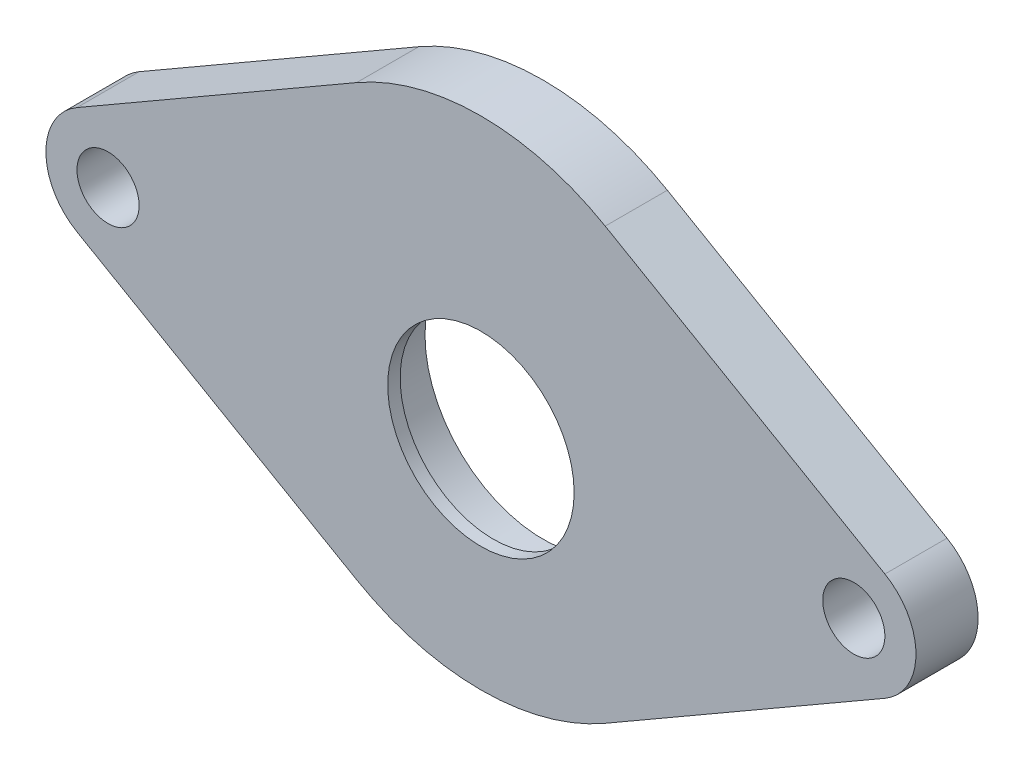
ISO-10303-21;
HEADER;
FILE_DESCRIPTION(('STEP AP214'),'2;1');
FILE_NAME('part.step','',(''),(''),'','','');
FILE_SCHEMA(('AUTOMOTIVE_DESIGN { 1 0 10303 214 1 1 1 1 }'));
ENDSEC;
DATA;
#1=APPLICATION_CONTEXT('core data for automotive mechanical design processes');
#2=APPLICATION_PROTOCOL_DEFINITION('international standard','automotive_design',2000,#1);
#3=PRODUCT_CONTEXT('',#1,'mechanical');
#4=PRODUCT('Part','Part','',(#3));
#5=PRODUCT_RELATED_PRODUCT_CATEGORY('part','',(#4));
#6=PRODUCT_DEFINITION_FORMATION('','',#4);
#7=PRODUCT_DEFINITION_CONTEXT('part definition',#1,'design');
#8=PRODUCT_DEFINITION('design','',#6,#7);
#9=PRODUCT_DEFINITION_SHAPE('','',#8);
#10=(LENGTH_UNIT() NAMED_UNIT(*) SI_UNIT(.MILLI.,.METRE.));
#11=(NAMED_UNIT(*) PLANE_ANGLE_UNIT() SI_UNIT($,.RADIAN.));
#12=(NAMED_UNIT(*) SI_UNIT($,.STERADIAN.) SOLID_ANGLE_UNIT());
#13=UNCERTAINTY_MEASURE_WITH_UNIT(LENGTH_MEASURE(1.E-05),#10,'distance_accuracy_value','');
#14=(GEOMETRIC_REPRESENTATION_CONTEXT(3) GLOBAL_UNCERTAINTY_ASSIGNED_CONTEXT((#13)) GLOBAL_UNIT_ASSIGNED_CONTEXT((#10,
#11,#12)) REPRESENTATION_CONTEXT('',''));
#15=CARTESIAN_POINT('',(0.,0.,0.));
#16=DIRECTION('',(0.,0.,1.));
#17=DIRECTION('',(1.,0.,0.));
#18=AXIS2_PLACEMENT_3D('',#15,#16,#17);
#19=CARTESIAN_POINT('',(0.,65.,10.));
#20=DIRECTION('',(0.,0.,-1.));
#21=DIRECTION('',(-1.,0.,0.));
#22=AXIS2_PLACEMENT_3D('',#19,#20,#21);
#23=CYLINDRICAL_SURFACE('',#22,40.);
#24=CARTESIAN_POINT('',(0.,65.,0.));
#25=DIRECTION('',(0.,0.,1.));
#26=DIRECTION('',(1.,0.,0.));
#27=AXIS2_PLACEMENT_3D('',#24,#25,#26);
#28=CIRCLE('',#27,40.);
#29=CARTESIAN_POINT('',(-20.,30.3589838486225,0.));
#30=VERTEX_POINT('',#29);
#31=CARTESIAN_POINT('',(20.,30.3589838486225,0.));
#32=VERTEX_POINT('',#31);
#33=EDGE_CURVE('E130',#30,#32,#28,.T.);
#34=ORIENTED_EDGE('',*,*,#33,.T.);
#35=DIRECTION('',(0.,0.,-1.));
#36=VECTOR('',#35,1.);
#37=CARTESIAN_POINT('',(20.,30.3589838486225,10.));
#38=LINE('',#37,#36);
#39=CARTESIAN_POINT('',(20.,30.3589838486225,10.));
#40=VERTEX_POINT('',#39);
#41=EDGE_CURVE('E11',#40,#32,#38,.T.);
#42=ORIENTED_EDGE('',*,*,#41,.F.);
#43=CARTESIAN_POINT('',(0.,65.,10.));
#44=DIRECTION('',(0.,0.,1.));
#45=DIRECTION('',(1.,0.,0.));
#46=AXIS2_PLACEMENT_3D('',#43,#44,#45);
#47=CIRCLE('',#46,40.);
#48=CARTESIAN_POINT('',(-20.,30.3589838486225,10.));
#49=VERTEX_POINT('',#48);
#50=EDGE_CURVE('E145',#49,#40,#47,.T.);
#51=ORIENTED_EDGE('',*,*,#50,.F.);
#52=DIRECTION('',(0.,0.,-1.));
#53=VECTOR('',#52,1.);
#54=CARTESIAN_POINT('',(-20.,30.3589838486225,10.));
#55=LINE('',#54,#53);
#56=EDGE_CURVE('E126',#49,#30,#55,.T.);
#57=ORIENTED_EDGE('',*,*,#56,.T.);
#58=EDGE_LOOP('',(#34,#42,#51,#57));
#59=FACE_BOUND('',#58,.T.);
#60=ADVANCED_FACE('F33',(#59),#23,.T.);
#61=CARTESIAN_POINT('',(20.,30.3589838486225,10.));
#62=DIRECTION('',(-0.5,0.866025403784439,0.));
#63=DIRECTION('',(-0.866025403784439,-0.5,0.));
#64=AXIS2_PLACEMENT_3D('',#61,#62,#63);
#65=PLANE('',#64);
#66=DIRECTION('',(0.866025403784439,0.5,0.));
#67=VECTOR('',#66,1.);
#68=CARTESIAN_POINT('',(20.,30.3589838486225,0.));
#69=LINE('',#68,#67);
#70=CARTESIAN_POINT('',(65.,56.3397459621556,0.));
#71=VERTEX_POINT('',#70);
#72=EDGE_CURVE('E133',#32,#71,#69,.T.);
#73=ORIENTED_EDGE('',*,*,#72,.T.);
#74=DIRECTION('',(0.,0.,-1.));
#75=VECTOR('',#74,1.);
#76=CARTESIAN_POINT('',(65.,56.3397459621556,10.));
#77=LINE('',#76,#75);
#78=CARTESIAN_POINT('',(65.,56.3397459621556,10.));
#79=VERTEX_POINT('',#78);
#80=EDGE_CURVE('E42',#79,#71,#77,.T.);
#81=ORIENTED_EDGE('',*,*,#80,.F.);
#82=DIRECTION('',(0.866025403784439,0.5,0.));
#83=VECTOR('',#82,1.);
#84=CARTESIAN_POINT('',(20.,30.3589838486225,10.));
#85=LINE('',#84,#83);
#86=EDGE_CURVE('E93',#40,#79,#85,.T.);
#87=ORIENTED_EDGE('',*,*,#86,.F.);
#88=ORIENTED_EDGE('',*,*,#41,.T.);
#89=EDGE_LOOP('',(#73,#81,#87,#88));
#90=FACE_BOUND('',#89,.T.);
#91=ADVANCED_FACE('F234',(#90),#65,.F.);
#92=CARTESIAN_POINT('',(60.,65.,10.));
#93=DIRECTION('',(0.,0.,-1.));
#94=DIRECTION('',(-1.,0.,0.));
#95=AXIS2_PLACEMENT_3D('',#92,#93,#94);
#96=CYLINDRICAL_SURFACE('',#95,9.99999999999998);
#97=CARTESIAN_POINT('',(60.,65.,0.));
#98=DIRECTION('',(0.,0.,1.));
#99=DIRECTION('',(1.,0.,0.));
#100=AXIS2_PLACEMENT_3D('',#97,#98,#99);
#101=CIRCLE('',#100,9.99999999999998);
#102=CARTESIAN_POINT('',(65.,73.6602540378444,0.));
#103=VERTEX_POINT('',#102);
#104=EDGE_CURVE('E136',#71,#103,#101,.T.);
#105=ORIENTED_EDGE('',*,*,#104,.T.);
#106=DIRECTION('',(0.,0.,-1.));
#107=VECTOR('',#106,1.);
#108=CARTESIAN_POINT('',(65.,73.6602540378444,10.));
#109=LINE('',#108,#107);
#110=CARTESIAN_POINT('',(65.,73.6602540378444,10.));
#111=VERTEX_POINT('',#110);
#112=EDGE_CURVE('E152',#111,#103,#109,.T.);
#113=ORIENTED_EDGE('',*,*,#112,.F.);
#114=CARTESIAN_POINT('',(60.,65.,10.));
#115=DIRECTION('',(0.,0.,1.));
#116=DIRECTION('',(1.,0.,0.));
#117=AXIS2_PLACEMENT_3D('',#114,#115,#116);
#118=CIRCLE('',#117,9.99999999999998);
#119=EDGE_CURVE('E161',#79,#111,#118,.T.);
#120=ORIENTED_EDGE('',*,*,#119,.F.);
#121=ORIENTED_EDGE('',*,*,#80,.T.);
#122=EDGE_LOOP('',(#105,#113,#120,#121));
#123=FACE_BOUND('',#122,.T.);
#124=ADVANCED_FACE('F159',(#123),#96,.T.);
#125=CARTESIAN_POINT('',(65.,73.6602540378444,10.));
#126=DIRECTION('',(-0.5,-0.866025403784438,0.));
#127=DIRECTION('',(0.866025403784438,-0.5,0.));
#128=AXIS2_PLACEMENT_3D('',#125,#126,#127);
#129=PLANE('',#128);
#130=DIRECTION('',(-0.866025403784438,0.5,0.));
#131=VECTOR('',#130,1.);
#132=CARTESIAN_POINT('',(65.,73.6602540378444,0.));
#133=LINE('',#132,#131);
#134=CARTESIAN_POINT('',(20.,99.6410161513775,0.));
#135=VERTEX_POINT('',#134);
#136=EDGE_CURVE('E138',#103,#135,#133,.T.);
#137=ORIENTED_EDGE('',*,*,#136,.T.);
#138=DIRECTION('',(0.,0.,-1.));
#139=VECTOR('',#138,1.);
#140=CARTESIAN_POINT('',(20.,99.6410161513775,10.));
#141=LINE('',#140,#139);
#142=CARTESIAN_POINT('',(20.,99.6410161513775,10.));
#143=VERTEX_POINT('',#142);
#144=EDGE_CURVE('E149',#143,#135,#141,.T.);
#145=ORIENTED_EDGE('',*,*,#144,.F.);
#146=DIRECTION('',(-0.866025403784438,0.5,0.));
#147=VECTOR('',#146,1.);
#148=CARTESIAN_POINT('',(65.,73.6602540378444,10.));
#149=LINE('',#148,#147);
#150=EDGE_CURVE('E173',#111,#143,#149,.T.);
#151=ORIENTED_EDGE('',*,*,#150,.F.);
#152=ORIENTED_EDGE('',*,*,#112,.T.);
#153=EDGE_LOOP('',(#137,#145,#151,#152));
#154=FACE_BOUND('',#153,.T.);
#155=ADVANCED_FACE('F169',(#154),#129,.F.);
#156=CARTESIAN_POINT('',(0.,65.,10.));
#157=DIRECTION('',(0.,0.,-1.));
#158=DIRECTION('',(-1.,0.,0.));
#159=AXIS2_PLACEMENT_3D('',#156,#157,#158);
#160=CYLINDRICAL_SURFACE('',#159,40.);
#161=CARTESIAN_POINT('',(0.,65.,0.));
#162=DIRECTION('',(0.,0.,1.));
#163=DIRECTION('',(1.,0.,0.));
#164=AXIS2_PLACEMENT_3D('',#161,#162,#163);
#165=CIRCLE('',#164,40.);
#166=CARTESIAN_POINT('',(-20.,99.6410161513775,0.));
#167=VERTEX_POINT('',#166);
#168=EDGE_CURVE('E140',#135,#167,#165,.T.);
#169=ORIENTED_EDGE('',*,*,#168,.T.);
#170=DIRECTION('',(0.,0.,-1.));
#171=VECTOR('',#170,1.);
#172=CARTESIAN_POINT('',(-20.,99.6410161513775,10.));
#173=LINE('',#172,#171);
#174=CARTESIAN_POINT('',(-20.,99.6410161513775,10.));
#175=VERTEX_POINT('',#174);
#176=EDGE_CURVE('E121',#175,#167,#173,.T.);
#177=ORIENTED_EDGE('',*,*,#176,.F.);
#178=CARTESIAN_POINT('',(0.,65.,10.));
#179=DIRECTION('',(0.,0.,1.));
#180=DIRECTION('',(1.,0.,0.));
#181=AXIS2_PLACEMENT_3D('',#178,#179,#180);
#182=CIRCLE('',#181,40.);
#183=EDGE_CURVE('E112',#143,#175,#182,.T.);
#184=ORIENTED_EDGE('',*,*,#183,.F.);
#185=ORIENTED_EDGE('',*,*,#144,.T.);
#186=EDGE_LOOP('',(#169,#177,#184,#185));
#187=FACE_BOUND('',#186,.T.);
#188=ADVANCED_FACE('F172',(#187),#160,.T.);
#189=CARTESIAN_POINT('',(-20.,99.6410161513775,10.));
#190=DIRECTION('',(0.499999999999999,-0.866025403784439,0.));
#191=DIRECTION('',(0.866025403784439,0.499999999999999,0.));
#192=AXIS2_PLACEMENT_3D('',#189,#190,#191);
#193=PLANE('',#192);
#194=DIRECTION('',(-0.866025403784439,-0.499999999999999,0.));
#195=VECTOR('',#194,1.);
#196=CARTESIAN_POINT('',(-20.,99.6410161513775,0.));
#197=LINE('',#196,#195);
#198=CARTESIAN_POINT('',(-65.,73.6602540378444,0.));
#199=VERTEX_POINT('',#198);
#200=EDGE_CURVE('E120',#167,#199,#197,.T.);
#201=ORIENTED_EDGE('',*,*,#200,.T.);
#202=DIRECTION('',(0.,0.,-1.));
#203=VECTOR('',#202,1.);
#204=CARTESIAN_POINT('',(-65.,73.6602540378444,10.));
#205=LINE('',#204,#203);
#206=CARTESIAN_POINT('',(-65.,73.6602540378444,10.));
#207=VERTEX_POINT('',#206);
#208=EDGE_CURVE('E117',#207,#199,#205,.T.);
#209=ORIENTED_EDGE('',*,*,#208,.F.);
#210=DIRECTION('',(-0.866025403784439,-0.499999999999999,0.));
#211=VECTOR('',#210,1.);
#212=CARTESIAN_POINT('',(-20.,99.6410161513775,10.));
#213=LINE('',#212,#211);
#214=EDGE_CURVE('E106',#175,#207,#213,.T.);
#215=ORIENTED_EDGE('',*,*,#214,.F.);
#216=ORIENTED_EDGE('',*,*,#176,.T.);
#217=EDGE_LOOP('',(#201,#209,#215,#216));
#218=FACE_BOUND('',#217,.T.);
#219=ADVANCED_FACE('F118',(#218),#193,.F.);
#220=CARTESIAN_POINT('',(-60.,65.,10.));
#221=DIRECTION('',(0.,0.,-1.));
#222=DIRECTION('',(-1.,0.,0.));
#223=AXIS2_PLACEMENT_3D('',#220,#221,#222);
#224=CYLINDRICAL_SURFACE('',#223,10.);
#225=CARTESIAN_POINT('',(-60.,65.,0.));
#226=DIRECTION('',(0.,0.,1.));
#227=DIRECTION('',(1.,0.,0.));
#228=AXIS2_PLACEMENT_3D('',#225,#226,#227);
#229=CIRCLE('',#228,10.);
#230=CARTESIAN_POINT('',(-65.,56.3397459621556,0.));
#231=VERTEX_POINT('',#230);
#232=EDGE_CURVE('E79',#199,#231,#229,.T.);
#233=ORIENTED_EDGE('',*,*,#232,.T.);
#234=DIRECTION('',(0.,0.,-1.));
#235=VECTOR('',#234,1.);
#236=CARTESIAN_POINT('',(-65.,56.3397459621556,10.));
#237=LINE('',#236,#235);
#238=CARTESIAN_POINT('',(-65.,56.3397459621556,10.));
#239=VERTEX_POINT('',#238);
#240=EDGE_CURVE('E122',#239,#231,#237,.T.);
#241=ORIENTED_EDGE('',*,*,#240,.F.);
#242=CARTESIAN_POINT('',(-60.,65.,10.));
#243=DIRECTION('',(0.,0.,1.));
#244=DIRECTION('',(1.,0.,0.));
#245=AXIS2_PLACEMENT_3D('',#242,#243,#244);
#246=CIRCLE('',#245,10.);
#247=EDGE_CURVE('E110',#207,#239,#246,.T.);
#248=ORIENTED_EDGE('',*,*,#247,.F.);
#249=ORIENTED_EDGE('',*,*,#208,.T.);
#250=EDGE_LOOP('',(#233,#241,#248,#249));
#251=FACE_BOUND('',#250,.T.);
#252=ADVANCED_FACE('F124',(#251),#224,.T.);
#253=CARTESIAN_POINT('',(-65.,56.3397459621556,10.));
#254=DIRECTION('',(0.499999999999999,0.866025403784439,0.));
#255=DIRECTION('',(-0.866025403784439,0.499999999999999,0.));
#256=AXIS2_PLACEMENT_3D('',#253,#254,#255);
#257=PLANE('',#256);
#258=DIRECTION('',(0.866025403784439,-0.499999999999999,0.));
#259=VECTOR('',#258,1.);
#260=CARTESIAN_POINT('',(-65.,56.3397459621556,0.));
#261=LINE('',#260,#259);
#262=EDGE_CURVE('E85',#231,#30,#261,.T.);
#263=ORIENTED_EDGE('',*,*,#262,.T.);
#264=ORIENTED_EDGE('',*,*,#56,.F.);
#265=DIRECTION('',(0.866025403784439,-0.499999999999999,0.));
#266=VECTOR('',#265,1.);
#267=CARTESIAN_POINT('',(-65.,56.3397459621556,10.));
#268=LINE('',#267,#266);
#269=EDGE_CURVE('E50',#239,#49,#268,.T.);
#270=ORIENTED_EDGE('',*,*,#269,.F.);
#271=ORIENTED_EDGE('',*,*,#240,.T.);
#272=EDGE_LOOP('',(#263,#264,#270,#271));
#273=FACE_BOUND('',#272,.T.);
#274=ADVANCED_FACE('F216',(#273),#257,.F.);
#275=CARTESIAN_POINT('',(0.,65.,10.));
#276=DIRECTION('',(0.,0.,1.));
#277=DIRECTION('',(1.,0.,0.));
#278=AXIS2_PLACEMENT_3D('',#275,#276,#277);
#279=PLANE('',#278);
#280=CARTESIAN_POINT('',(60.,65.,10.));
#281=DIRECTION('',(0.,0.,1.));
#282=DIRECTION('',(1.,0.,0.));
#283=AXIS2_PLACEMENT_3D('',#280,#281,#282);
#284=CIRCLE('',#283,5.00000000000001);
#285=CARTESIAN_POINT('',(65.,65.,10.));
#286=VERTEX_POINT('',#285);
#287=EDGE_CURVE('E188',#286,#286,#284,.T.);
#288=ORIENTED_EDGE('',*,*,#287,.F.);
#289=EDGE_LOOP('',(#288));
#290=FACE_BOUND('',#289,.T.);
#291=CARTESIAN_POINT('',(0.,60.,10.));
#292=DIRECTION('',(0.,0.,1.));
#293=DIRECTION('',(1.,0.,0.));
#294=AXIS2_PLACEMENT_3D('',#291,#292,#293);
#295=CIRCLE('',#294,15.);
#296=CARTESIAN_POINT('',(15.,60.,10.));
#297=VERTEX_POINT('',#296);
#298=EDGE_CURVE('E185',#297,#297,#295,.T.);
#299=ORIENTED_EDGE('',*,*,#298,.F.);
#300=EDGE_LOOP('',(#299));
#301=FACE_BOUND('',#300,.T.);
#302=CARTESIAN_POINT('',(-60.,65.,10.));
#303=DIRECTION('',(0.,0.,1.));
#304=DIRECTION('',(1.,0.,0.));
#305=AXIS2_PLACEMENT_3D('',#302,#303,#304);
#306=CIRCLE('',#305,5.00000000000001);
#307=CARTESIAN_POINT('',(-55.,65.,10.));
#308=VERTEX_POINT('',#307);
#309=EDGE_CURVE('E134',#308,#308,#306,.T.);
#310=ORIENTED_EDGE('',*,*,#309,.F.);
#311=EDGE_LOOP('',(#310));
#312=FACE_BOUND('',#311,.T.);
#313=ORIENTED_EDGE('',*,*,#50,.T.);
#314=ORIENTED_EDGE('',*,*,#86,.T.);
#315=ORIENTED_EDGE('',*,*,#119,.T.);
#316=ORIENTED_EDGE('',*,*,#150,.T.);
#317=ORIENTED_EDGE('',*,*,#183,.T.);
#318=ORIENTED_EDGE('',*,*,#214,.T.);
#319=ORIENTED_EDGE('',*,*,#247,.T.);
#320=ORIENTED_EDGE('',*,*,#269,.T.);
#321=EDGE_LOOP('',(#313,#314,#315,#316,#317,#318,#319,#320));
#322=FACE_BOUND('',#321,.T.);
#323=ADVANCED_FACE('F108',(#290,#301,#312,#322),#279,.T.);
#324=CARTESIAN_POINT('',(0.,65.,0.));
#325=DIRECTION('',(0.,0.,1.));
#326=DIRECTION('',(1.,0.,0.));
#327=AXIS2_PLACEMENT_3D('',#324,#325,#326);
#328=PLANE('',#327);
#329=CARTESIAN_POINT('',(0.,60.,0.));
#330=DIRECTION('',(0.,0.,1.));
#331=DIRECTION('',(1.,0.,0.));
#332=AXIS2_PLACEMENT_3D('',#329,#330,#331);
#333=CIRCLE('',#332,19.);
#334=CARTESIAN_POINT('',(19.,60.,0.));
#335=VERTEX_POINT('',#334);
#336=EDGE_CURVE('E193',#335,#335,#333,.T.);
#337=ORIENTED_EDGE('',*,*,#336,.T.);
#338=EDGE_LOOP('',(#337));
#339=FACE_BOUND('',#338,.T.);
#340=CARTESIAN_POINT('',(60.,65.,0.));
#341=DIRECTION('',(0.,0.,1.));
#342=DIRECTION('',(1.,0.,0.));
#343=AXIS2_PLACEMENT_3D('',#340,#341,#342);
#344=CIRCLE('',#343,5.00000000000001);
#345=CARTESIAN_POINT('',(65.,65.,0.));
#346=VERTEX_POINT('',#345);
#347=EDGE_CURVE('E182',#346,#346,#344,.T.);
#348=ORIENTED_EDGE('',*,*,#347,.T.);
#349=EDGE_LOOP('',(#348));
#350=FACE_BOUND('',#349,.T.);
#351=CARTESIAN_POINT('',(-60.,65.,0.));
#352=DIRECTION('',(0.,0.,1.));
#353=DIRECTION('',(1.,0.,0.));
#354=AXIS2_PLACEMENT_3D('',#351,#352,#353);
#355=CIRCLE('',#354,5.00000000000001);
#356=CARTESIAN_POINT('',(-55.,65.,0.));
#357=VERTEX_POINT('',#356);
#358=EDGE_CURVE('E179',#357,#357,#355,.T.);
#359=ORIENTED_EDGE('',*,*,#358,.T.);
#360=EDGE_LOOP('',(#359));
#361=FACE_BOUND('',#360,.T.);
#362=ORIENTED_EDGE('',*,*,#33,.F.);
#363=ORIENTED_EDGE('',*,*,#262,.F.);
#364=ORIENTED_EDGE('',*,*,#232,.F.);
#365=ORIENTED_EDGE('',*,*,#200,.F.);
#366=ORIENTED_EDGE('',*,*,#168,.F.);
#367=ORIENTED_EDGE('',*,*,#136,.F.);
#368=ORIENTED_EDGE('',*,*,#104,.F.);
#369=ORIENTED_EDGE('',*,*,#72,.F.);
#370=EDGE_LOOP('',(#362,#363,#364,#365,#366,#367,#368,#369));
#371=FACE_BOUND('',#370,.T.);
#372=ADVANCED_FACE('F165',(#339,#350,#361,#371),#328,.F.);
#373=CARTESIAN_POINT('',(-60.,65.,10.));
#374=DIRECTION('',(0.,0.,-1.));
#375=DIRECTION('',(-1.,0.,0.));
#376=AXIS2_PLACEMENT_3D('',#373,#374,#375);
#377=CYLINDRICAL_SURFACE('',#376,5.00000000000001);
#378=ORIENTED_EDGE('',*,*,#309,.T.);
#379=EDGE_LOOP('',(#378));
#380=FACE_BOUND('',#379,.T.);
#381=ORIENTED_EDGE('',*,*,#358,.F.);
#382=EDGE_LOOP('',(#381));
#383=FACE_BOUND('',#382,.T.);
#384=ADVANCED_FACE('F210',(#380,#383),#377,.F.);
#385=CARTESIAN_POINT('',(0.,60.,10.));
#386=DIRECTION('',(0.,0.,-1.));
#387=DIRECTION('',(-1.,0.,0.));
#388=AXIS2_PLACEMENT_3D('',#385,#386,#387);
#389=CYLINDRICAL_SURFACE('',#388,15.);
#390=CARTESIAN_POINT('',(0.,60.,8.));
#391=DIRECTION('',(0.,0.,1.));
#392=DIRECTION('',(1.,0.,0.));
#393=AXIS2_PLACEMENT_3D('',#390,#391,#392);
#394=CIRCLE('',#393,15.);
#395=CARTESIAN_POINT('',(15.,60.,8.));
#396=VERTEX_POINT('',#395);
#397=EDGE_CURVE('E36',#396,#396,#394,.T.);
#398=ORIENTED_EDGE('',*,*,#397,.F.);
#399=EDGE_LOOP('',(#398));
#400=FACE_BOUND('',#399,.T.);
#401=ORIENTED_EDGE('',*,*,#298,.T.);
#402=EDGE_LOOP('',(#401));
#403=FACE_BOUND('',#402,.T.);
#404=ADVANCED_FACE('F206',(#400,#403),#389,.F.);
#405=CARTESIAN_POINT('',(60.,65.,10.));
#406=DIRECTION('',(0.,0.,-1.));
#407=DIRECTION('',(-1.,0.,0.));
#408=AXIS2_PLACEMENT_3D('',#405,#406,#407);
#409=CYLINDRICAL_SURFACE('',#408,5.00000000000001);
#410=ORIENTED_EDGE('',*,*,#287,.T.);
#411=EDGE_LOOP('',(#410));
#412=FACE_BOUND('',#411,.T.);
#413=ORIENTED_EDGE('',*,*,#347,.F.);
#414=EDGE_LOOP('',(#413));
#415=FACE_BOUND('',#414,.T.);
#416=ADVANCED_FACE('F209',(#412,#415),#409,.F.);
#417=CARTESIAN_POINT('',(0.,60.,8.));
#418=DIRECTION('',(0.,0.,-1.));
#419=DIRECTION('',(-1.,0.,0.));
#420=AXIS2_PLACEMENT_3D('',#417,#418,#419);
#421=CYLINDRICAL_SURFACE('',#420,19.);
#422=CARTESIAN_POINT('',(0.,60.,8.));
#423=DIRECTION('',(0.,0.,1.));
#424=DIRECTION('',(1.,0.,0.));
#425=AXIS2_PLACEMENT_3D('',#422,#423,#424);
#426=CIRCLE('',#425,19.);
#427=CARTESIAN_POINT('',(19.,60.,8.));
#428=VERTEX_POINT('',#427);
#429=EDGE_CURVE('E196',#428,#428,#426,.T.);
#430=ORIENTED_EDGE('',*,*,#429,.T.);
#431=EDGE_LOOP('',(#430));
#432=FACE_BOUND('',#431,.T.);
#433=ORIENTED_EDGE('',*,*,#336,.F.);
#434=EDGE_LOOP('',(#433));
#435=FACE_BOUND('',#434,.T.);
#436=ADVANCED_FACE('F300',(#432,#435),#421,.F.);
#437=CARTESIAN_POINT('',(0.,60.,8.));
#438=DIRECTION('',(0.,0.,1.));
#439=DIRECTION('',(1.,0.,0.));
#440=AXIS2_PLACEMENT_3D('',#437,#438,#439);
#441=PLANE('',#440);
#442=ORIENTED_EDGE('',*,*,#397,.T.);
#443=EDGE_LOOP('',(#442));
#444=FACE_BOUND('',#443,.T.);
#445=ORIENTED_EDGE('',*,*,#429,.F.);
#446=EDGE_LOOP('',(#445));
#447=FACE_BOUND('',#446,.T.);
#448=ADVANCED_FACE('F203',(#444,#447),#441,.F.);
#449=CLOSED_SHELL('',(#60,#91,#124,#155,#188,#219,#252,#274,#323,#372,#384,#404,#416,#436,#448));
#450=MANIFOLD_SOLID_BREP('B2',#449);
#451=ADVANCED_BREP_SHAPE_REPRESENTATION('',(#18,#450),#14);
#452=SHAPE_DEFINITION_REPRESENTATION(#9,#451);
ENDSEC;
END-ISO-10303-21;
